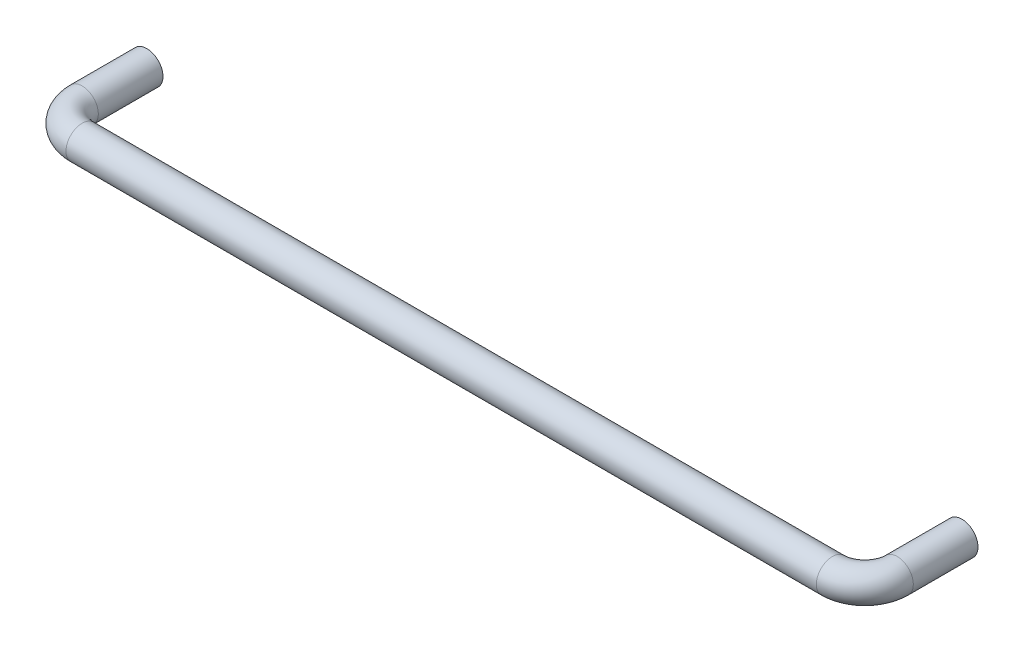
ISO-10303-21;
HEADER;
FILE_DESCRIPTION(('STEP AP214'),'2;1');
FILE_NAME('part.step','',(''),(''),'','','');
FILE_SCHEMA(('AUTOMOTIVE_DESIGN { 1 0 10303 214 1 1 1 1 }'));
ENDSEC;
DATA;
#1=APPLICATION_CONTEXT('core data for automotive mechanical design processes');
#2=APPLICATION_PROTOCOL_DEFINITION('international standard','automotive_design',2000,#1);
#3=PRODUCT_CONTEXT('',#1,'mechanical');
#4=PRODUCT('Part','Part','',(#3));
#5=PRODUCT_RELATED_PRODUCT_CATEGORY('part','',(#4));
#6=PRODUCT_DEFINITION_FORMATION('','',#4);
#7=PRODUCT_DEFINITION_CONTEXT('part definition',#1,'design');
#8=PRODUCT_DEFINITION('design','',#6,#7);
#9=PRODUCT_DEFINITION_SHAPE('','',#8);
#10=(LENGTH_UNIT() NAMED_UNIT(*) SI_UNIT(.MILLI.,.METRE.));
#11=(NAMED_UNIT(*) PLANE_ANGLE_UNIT() SI_UNIT($,.RADIAN.));
#12=(NAMED_UNIT(*) SI_UNIT($,.STERADIAN.) SOLID_ANGLE_UNIT());
#13=UNCERTAINTY_MEASURE_WITH_UNIT(LENGTH_MEASURE(1.E-05),#10,'distance_accuracy_value','');
#14=(GEOMETRIC_REPRESENTATION_CONTEXT(3) GLOBAL_UNCERTAINTY_ASSIGNED_CONTEXT((#13)) GLOBAL_UNIT_ASSIGNED_CONTEXT((#10,
#11,#12)) REPRESENTATION_CONTEXT('',''));
#15=CARTESIAN_POINT('',(0.,0.,0.));
#16=DIRECTION('',(0.,0.,1.));
#17=DIRECTION('',(1.,0.,0.));
#18=AXIS2_PLACEMENT_3D('',#15,#16,#17);
#19=CARTESIAN_POINT('',(9.99999999999999,0.,30.));
#20=DIRECTION('',(1.,0.,0.));
#21=DIRECTION('',(0.,1.,0.));
#22=AXIS2_PLACEMENT_3D('',#19,#20,#21);
#23=CYLINDRICAL_SURFACE('',#22,5.);
#24=CARTESIAN_POINT('',(9.99999999999999,0.,30.));
#25=DIRECTION('',(1.,0.,0.));
#26=DIRECTION('',(0.,0.,-1.));
#27=AXIS2_PLACEMENT_3D('',#24,#25,#26);
#28=CIRCLE('',#27,5.);
#29=CARTESIAN_POINT('',(9.99999999999998,0.,35.));
#30=VERTEX_POINT('',#29);
#31=EDGE_CURVE('E11',#30,#30,#28,.T.);
#32=ORIENTED_EDGE('',*,*,#31,.T.);
#33=EDGE_LOOP('',(#32));
#34=FACE_BOUND('',#33,.T.);
#35=CARTESIAN_POINT('',(242.,0.,30.0000000000002));
#36=DIRECTION('',(1.,0.,0.));
#37=DIRECTION('',(0.,0.,-1.));
#38=AXIS2_PLACEMENT_3D('',#35,#36,#37);
#39=CIRCLE('',#38,5.);
#40=CARTESIAN_POINT('',(242.,0.,35.0000000000002));
#41=VERTEX_POINT('',#40);
#42=EDGE_CURVE('E63',#41,#41,#39,.T.);
#43=ORIENTED_EDGE('',*,*,#42,.F.);
#44=EDGE_LOOP('',(#43));
#45=FACE_BOUND('',#44,.T.);
#46=ADVANCED_FACE('F32',(#34,#45),#23,.T.);
#47=CARTESIAN_POINT('',(10.,0.,20.));
#48=DIRECTION('',(0.,1.,0.));
#49=DIRECTION('',(0.,0.,1.));
#50=AXIS2_PLACEMENT_3D('',#47,#48,#49);
#51=TOROIDAL_SURFACE('',#50,10.,5.);
#52=CARTESIAN_POINT('',(0.,0.,20.));
#53=DIRECTION('',(0.,0.,1.));
#54=DIRECTION('',(1.,0.,0.));
#55=AXIS2_PLACEMENT_3D('',#52,#53,#54);
#56=CIRCLE('',#55,5.);
#57=CARTESIAN_POINT('',(-5.,0.,20.));
#58=VERTEX_POINT('',#57);
#59=EDGE_CURVE('E39',#58,#58,#56,.T.);
#60=CARTESIAN_POINT('',(10.,0.,20.));
#61=DIRECTION('',(0.,1.,0.));
#62=DIRECTION('',(0.,0.,1.));
#63=AXIS2_PLACEMENT_3D('',#60,#61,#62);
#64=CIRCLE('',#63,15.);
#65=EDGE_CURVE('',#58,#30,#64,.T.);
#66=ORIENTED_EDGE('',*,*,#59,.T.);
#67=ORIENTED_EDGE('',*,*,#31,.F.);
#68=ORIENTED_EDGE('',*,*,#65,.T.);
#69=ORIENTED_EDGE('',*,*,#65,.F.);
#70=EDGE_LOOP('',(#66,#68,#67,#69));
#71=FACE_BOUND('',#70,.T.);
#72=ADVANCED_FACE('F93',(#71),#51,.T.);
#73=CARTESIAN_POINT('',(0.,0.,20.));
#74=DIRECTION('',(0.,0.,-1.));
#75=DIRECTION('',(-1.,0.,0.));
#76=AXIS2_PLACEMENT_3D('',#73,#74,#75);
#77=CYLINDRICAL_SURFACE('',#76,5.);
#78=ORIENTED_EDGE('',*,*,#59,.F.);
#79=EDGE_LOOP('',(#78));
#80=FACE_BOUND('',#79,.T.);
#81=CARTESIAN_POINT('',(0.,0.,0.));
#82=DIRECTION('',(0.,0.,1.));
#83=DIRECTION('',(1.,0.,0.));
#84=AXIS2_PLACEMENT_3D('',#81,#82,#83);
#85=CIRCLE('',#84,5.);
#86=CARTESIAN_POINT('',(5.,0.,0.));
#87=VERTEX_POINT('',#86);
#88=EDGE_CURVE('E74',#87,#87,#85,.T.);
#89=ORIENTED_EDGE('',*,*,#88,.T.);
#90=EDGE_LOOP('',(#89));
#91=FACE_BOUND('',#90,.T.);
#92=ADVANCED_FACE('F79',(#80,#91),#77,.T.);
#93=CARTESIAN_POINT('',(0.,0.,0.));
#94=DIRECTION('',(0.,0.,1.));
#95=DIRECTION('',(1.,0.,0.));
#96=AXIS2_PLACEMENT_3D('',#93,#94,#95);
#97=PLANE('',#96);
#98=CARTESIAN_POINT('',(0.,0.,0.));
#99=DIRECTION('',(0.,0.,-1.));
#100=DIRECTION('',(-1.,0.,0.));
#101=AXIS2_PLACEMENT_3D('',#98,#99,#100);
#102=CIRCLE('',#101,1.5);
#103=CARTESIAN_POINT('',(-1.5,0.,0.));
#104=VERTEX_POINT('',#103);
#105=EDGE_CURVE('E71',#104,#104,#102,.T.);
#106=ORIENTED_EDGE('',*,*,#105,.F.);
#107=EDGE_LOOP('',(#106));
#108=FACE_BOUND('',#107,.T.);
#109=ORIENTED_EDGE('',*,*,#88,.F.);
#110=EDGE_LOOP('',(#109));
#111=FACE_BOUND('',#110,.T.);
#112=ADVANCED_FACE('F81',(#108,#111),#97,.F.);
#113=CARTESIAN_POINT('',(0.,0.,0.));
#114=DIRECTION('',(0.,0.,-1.));
#115=DIRECTION('',(-1.,0.,0.));
#116=AXIS2_PLACEMENT_3D('',#113,#114,#115);
#117=CYLINDRICAL_SURFACE('',#116,1.5);
#118=CARTESIAN_POINT('',(0.,0.,3.));
#119=DIRECTION('',(0.,0.,-1.));
#120=DIRECTION('',(-1.,0.,0.));
#121=AXIS2_PLACEMENT_3D('',#118,#119,#120);
#122=CIRCLE('',#121,1.5);
#123=CARTESIAN_POINT('',(-1.5,0.,3.));
#124=VERTEX_POINT('',#123);
#125=EDGE_CURVE('E68',#124,#124,#122,.T.);
#126=ORIENTED_EDGE('',*,*,#125,.F.);
#127=EDGE_LOOP('',(#126));
#128=FACE_BOUND('',#127,.T.);
#129=ORIENTED_EDGE('',*,*,#105,.T.);
#130=EDGE_LOOP('',(#129));
#131=FACE_BOUND('',#130,.T.);
#132=ADVANCED_FACE('F83',(#128,#131),#117,.F.);
#133=CARTESIAN_POINT('',(0.,0.,3.));
#134=DIRECTION('',(0.,0.,-1.));
#135=DIRECTION('',(-1.,0.,0.));
#136=AXIS2_PLACEMENT_3D('',#133,#134,#135);
#137=CONICAL_SURFACE('',#136,1.5,1.02974425867665);
#138=CARTESIAN_POINT('',(0.,0.,3.90129092854134));
#139=VERTEX_POINT('',#138);
#140=VERTEX_LOOP('',#139);
#141=FACE_BOUND('',#140,.T.);
#142=ORIENTED_EDGE('',*,*,#125,.T.);
#143=EDGE_LOOP('',(#142));
#144=FACE_BOUND('',#143,.T.);
#145=ADVANCED_FACE('F90',(#141,#144),#137,.F.);
#146=CARTESIAN_POINT('',(242.,0.,20.0000000000002));
#147=DIRECTION('',(0.,1.,0.));
#148=DIRECTION('',(0.,0.,1.));
#149=AXIS2_PLACEMENT_3D('',#146,#147,#148);
#150=TOROIDAL_SURFACE('',#149,10.,5.);
#151=CARTESIAN_POINT('',(252.,0.,20.0000000000002));
#152=DIRECTION('',(0.,0.,-1.));
#153=DIRECTION('',(-1.,0.,0.));
#154=AXIS2_PLACEMENT_3D('',#151,#152,#153);
#155=CIRCLE('',#154,5.);
#156=CARTESIAN_POINT('',(257.,0.,20.0000000000002));
#157=VERTEX_POINT('',#156);
#158=EDGE_CURVE('E60',#157,#157,#155,.T.);
#159=CARTESIAN_POINT('',(242.,0.,20.0000000000002));
#160=DIRECTION('',(0.,1.,0.));
#161=DIRECTION('',(0.,0.,1.));
#162=AXIS2_PLACEMENT_3D('',#159,#160,#161);
#163=CIRCLE('',#162,15.);
#164=EDGE_CURVE('',#41,#157,#163,.T.);
#165=ORIENTED_EDGE('',*,*,#42,.T.);
#166=ORIENTED_EDGE('',*,*,#158,.F.);
#167=ORIENTED_EDGE('',*,*,#164,.T.);
#168=ORIENTED_EDGE('',*,*,#164,.F.);
#169=EDGE_LOOP('',(#165,#167,#166,#168));
#170=FACE_BOUND('',#169,.T.);
#171=ADVANCED_FACE('F107',(#170),#150,.T.);
#172=CARTESIAN_POINT('',(252.,0.,20.0000000000002));
#173=DIRECTION('',(0.,0.,-1.));
#174=DIRECTION('',(1.,0.,0.));
#175=AXIS2_PLACEMENT_3D('',#172,#173,#174);
#176=CYLINDRICAL_SURFACE('',#175,5.);
#177=ORIENTED_EDGE('',*,*,#158,.T.);
#178=EDGE_LOOP('',(#177));
#179=FACE_BOUND('',#178,.T.);
#180=CARTESIAN_POINT('',(252.,0.,2.39251511433688E-13));
#181=DIRECTION('',(0.,0.,-1.));
#182=DIRECTION('',(-1.,0.,0.));
#183=AXIS2_PLACEMENT_3D('',#180,#181,#182);
#184=CIRCLE('',#183,5.);
#185=CARTESIAN_POINT('',(247.,0.,2.29757403837113E-13));
#186=VERTEX_POINT('',#185);
#187=EDGE_CURVE('E57',#186,#186,#184,.T.);
#188=ORIENTED_EDGE('',*,*,#187,.F.);
#189=EDGE_LOOP('',(#188));
#190=FACE_BOUND('',#189,.T.);
#191=ADVANCED_FACE('F109',(#179,#190),#176,.T.);
#192=CARTESIAN_POINT('',(252.,0.,2.39251511433688E-13));
#193=DIRECTION('',(0.,0.,1.));
#194=DIRECTION('',(-1.,0.,0.));
#195=AXIS2_PLACEMENT_3D('',#192,#193,#194);
#196=PLANE('',#195);
#197=CARTESIAN_POINT('',(252.,0.,2.39312741751379E-13));
#198=DIRECTION('',(0.,0.,1.));
#199=DIRECTION('',(1.,0.,0.));
#200=AXIS2_PLACEMENT_3D('',#197,#198,#199);
#201=CIRCLE('',#200,1.5);
#202=CARTESIAN_POINT('',(253.5,0.,2.42160974030352E-13));
#203=VERTEX_POINT('',#202);
#204=EDGE_CURVE('E54',#203,#203,#201,.T.);
#205=ORIENTED_EDGE('',*,*,#204,.T.);
#206=EDGE_LOOP('',(#205));
#207=FACE_BOUND('',#206,.T.);
#208=ORIENTED_EDGE('',*,*,#187,.T.);
#209=EDGE_LOOP('',(#208));
#210=FACE_BOUND('',#209,.T.);
#211=ADVANCED_FACE('F116',(#207,#210),#196,.F.);
#212=CARTESIAN_POINT('',(252.,0.,2.39251511433688E-13));
#213=DIRECTION('',(0.,0.,-1.));
#214=DIRECTION('',(1.,0.,0.));
#215=AXIS2_PLACEMENT_3D('',#212,#213,#214);
#216=CYLINDRICAL_SURFACE('',#215,1.5);
#217=CARTESIAN_POINT('',(252.,0.,3.00000000000024));
#218=DIRECTION('',(0.,0.,1.));
#219=DIRECTION('',(1.,0.,0.));
#220=AXIS2_PLACEMENT_3D('',#217,#218,#219);
#221=CIRCLE('',#220,1.5);
#222=CARTESIAN_POINT('',(253.5,0.,3.00000000000024));
#223=VERTEX_POINT('',#222);
#224=EDGE_CURVE('E52',#223,#223,#221,.T.);
#225=ORIENTED_EDGE('',*,*,#224,.T.);
#226=EDGE_LOOP('',(#225));
#227=FACE_BOUND('',#226,.T.);
#228=ORIENTED_EDGE('',*,*,#204,.F.);
#229=EDGE_LOOP('',(#228));
#230=FACE_BOUND('',#229,.T.);
#231=ADVANCED_FACE('F48',(#227,#230),#216,.F.);
#232=CARTESIAN_POINT('',(252.,0.,3.00000000000024));
#233=DIRECTION('',(0.,0.,-1.));
#234=DIRECTION('',(1.,0.,0.));
#235=AXIS2_PLACEMENT_3D('',#232,#233,#234);
#236=CONICAL_SURFACE('',#235,1.5,1.02974425867665);
#237=CARTESIAN_POINT('',(252.,0.,3.90129092854158));
#238=VERTEX_POINT('',#237);
#239=VERTEX_LOOP('',#238);
#240=FACE_BOUND('',#239,.T.);
#241=ORIENTED_EDGE('',*,*,#224,.F.);
#242=EDGE_LOOP('',(#241));
#243=FACE_BOUND('',#242,.T.);
#244=ADVANCED_FACE('F45',(#240,#243),#236,.F.);
#245=CLOSED_SHELL('',(#46,#72,#92,#112,#132,#145,#171,#191,#211,#231,#244));
#246=MANIFOLD_SOLID_BREP('B2',#245);
#247=ADVANCED_BREP_SHAPE_REPRESENTATION('',(#18,#246),#14);
#248=SHAPE_DEFINITION_REPRESENTATION(#9,#247);
ENDSEC;
END-ISO-10303-21;
